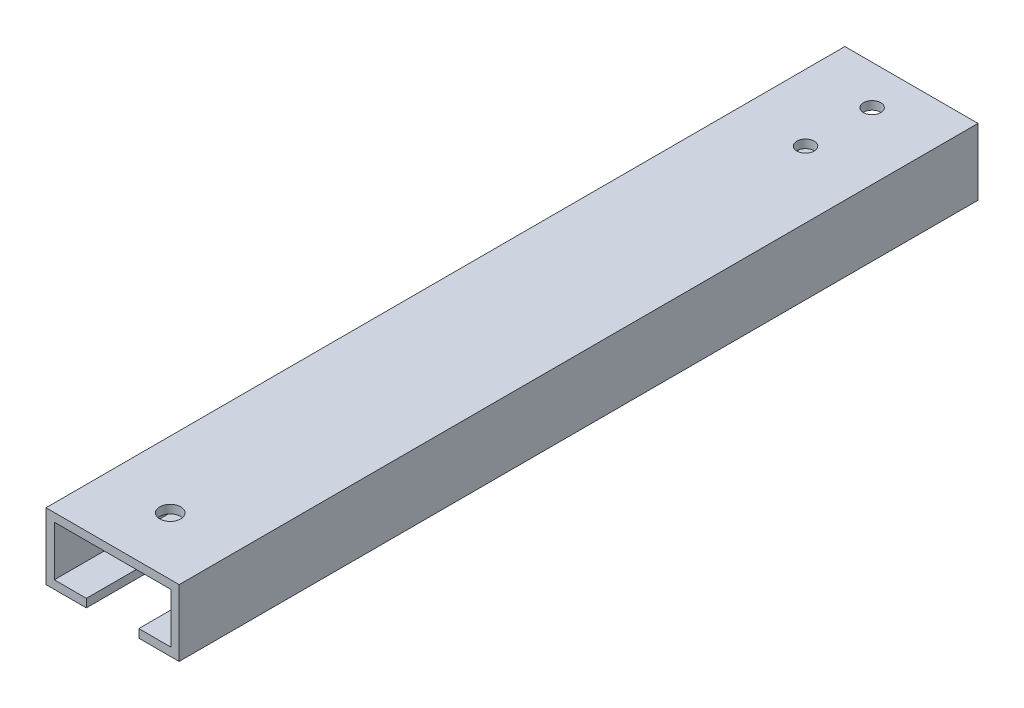
ISO-10303-21;
HEADER;
FILE_DESCRIPTION(('STEP AP214'),'2;1');
FILE_NAME('part.step','',(''),(''),'','','');
FILE_SCHEMA(('AUTOMOTIVE_DESIGN { 1 0 10303 214 1 1 1 1 }'));
ENDSEC;
DATA;
#1=APPLICATION_CONTEXT('core data for automotive mechanical design processes');
#2=APPLICATION_PROTOCOL_DEFINITION('international standard','automotive_design',2000,#1);
#3=PRODUCT_CONTEXT('',#1,'mechanical');
#4=PRODUCT('Part','Part','',(#3));
#5=PRODUCT_RELATED_PRODUCT_CATEGORY('part','',(#4));
#6=PRODUCT_DEFINITION_FORMATION('','',#4);
#7=PRODUCT_DEFINITION_CONTEXT('part definition',#1,'design');
#8=PRODUCT_DEFINITION('design','',#6,#7);
#9=PRODUCT_DEFINITION_SHAPE('','',#8);
#10=(LENGTH_UNIT() NAMED_UNIT(*) SI_UNIT(.MILLI.,.METRE.));
#11=(NAMED_UNIT(*) PLANE_ANGLE_UNIT() SI_UNIT($,.RADIAN.));
#12=(NAMED_UNIT(*) SI_UNIT($,.STERADIAN.) SOLID_ANGLE_UNIT());
#13=UNCERTAINTY_MEASURE_WITH_UNIT(LENGTH_MEASURE(1.E-05),#10,'distance_accuracy_value','');
#14=(GEOMETRIC_REPRESENTATION_CONTEXT(3) GLOBAL_UNCERTAINTY_ASSIGNED_CONTEXT((#13)) GLOBAL_UNIT_ASSIGNED_CONTEXT((#10,
#11,#12)) REPRESENTATION_CONTEXT('',''));
#15=CARTESIAN_POINT('',(0.,0.,0.));
#16=DIRECTION('',(0.,0.,1.));
#17=DIRECTION('',(1.,0.,0.));
#18=AXIS2_PLACEMENT_3D('',#15,#16,#17);
#19=CARTESIAN_POINT('',(-11.1125,-4.7625,152.4));
#20=DIRECTION('',(0.,1.,0.));
#21=DIRECTION('',(-1.,0.,0.));
#22=AXIS2_PLACEMENT_3D('',#19,#20,#21);
#23=PLANE('',#22);
#24=CARTESIAN_POINT('',(0.,-4.7625,20.199999986));
#25=DIRECTION('',(0.,1.,0.));
#26=DIRECTION('',(-1.,0.,0.));
#27=AXIS2_PLACEMENT_3D('',#24,#25,#26);
#28=CIRCLE('',#27,1.64999999999999);
#29=CARTESIAN_POINT('',(-1.64999999999999,-4.7625,20.199999986));
#30=VERTEX_POINT('',#29);
#31=EDGE_CURVE('E370',#30,#30,#28,.T.);
#32=ORIENTED_EDGE('',*,*,#31,.F.);
#33=EDGE_LOOP('',(#32));
#34=FACE_BOUND('',#33,.T.);
#35=CARTESIAN_POINT('',(0.,-4.7625,7.5));
#36=DIRECTION('',(0.,1.,0.));
#37=DIRECTION('',(-1.,0.,0.));
#38=AXIS2_PLACEMENT_3D('',#35,#36,#37);
#39=CIRCLE('',#38,1.64999999999999);
#40=CARTESIAN_POINT('',(-1.64999999999999,-4.7625,7.5));
#41=VERTEX_POINT('',#40);
#42=EDGE_CURVE('E158',#41,#41,#39,.T.);
#43=ORIENTED_EDGE('',*,*,#42,.F.);
#44=EDGE_LOOP('',(#43));
#45=FACE_BOUND('',#44,.T.);
#46=CARTESIAN_POINT('',(7.99999999999989,-4.7625,141.400000000002));
#47=DIRECTION('',(0.,1.,0.));
#48=DIRECTION('',(-1.,0.,0.));
#49=AXIS2_PLACEMENT_3D('',#46,#47,#48);
#50=CIRCLE('',#49,1.50041933445592);
#51=CARTESIAN_POINT('',(6.49958066554398,-4.7625,141.400000000002));
#52=VERTEX_POINT('',#51);
#53=EDGE_CURVE('E149',#52,#52,#50,.F.);
#54=ORIENTED_EDGE('',*,*,#53,.T.);
#55=EDGE_LOOP('',(#54));
#56=FACE_BOUND('',#55,.T.);
#57=CARTESIAN_POINT('',(-8.00000000000234,-4.7625,141.4));
#58=DIRECTION('',(0.,1.,0.));
#59=DIRECTION('',(-1.,0.,0.));
#60=AXIS2_PLACEMENT_3D('',#57,#58,#59);
#61=CIRCLE('',#60,1.50041933445598);
#62=CARTESIAN_POINT('',(-9.50041933445832,-4.7625,141.4));
#63=VERTEX_POINT('',#62);
#64=EDGE_CURVE('E180',#63,#63,#61,.F.);
#65=ORIENTED_EDGE('',*,*,#64,.T.);
#66=EDGE_LOOP('',(#65));
#67=FACE_BOUND('',#66,.T.);
#68=DIRECTION('',(1.,0.,0.));
#69=VECTOR('',#68,1.);
#70=CARTESIAN_POINT('',(-11.1125,-4.7625,136.400000000001));
#71=LINE('',#70,#69);
#72=CARTESIAN_POINT('',(-5.00000000000122,-4.7625,136.400000000001));
#73=VERTEX_POINT('',#72);
#74=CARTESIAN_POINT('',(4.99999999999878,-4.76250000000006,136.400000000001));
#75=VERTEX_POINT('',#74);
#76=EDGE_CURVE('E52',#73,#75,#71,.T.);
#77=ORIENTED_EDGE('',*,*,#76,.T.);
#78=DIRECTION('',(0.,0.,1.));
#79=VECTOR('',#78,1.);
#80=CARTESIAN_POINT('',(4.99999999999878,-4.7625,152.4));
#81=LINE('',#80,#79);
#82=CARTESIAN_POINT('',(4.99999999999878,-4.76250000000006,152.4));
#83=VERTEX_POINT('',#82);
#84=EDGE_CURVE('E11',#75,#83,#81,.T.);
#85=ORIENTED_EDGE('',*,*,#84,.T.);
#86=DIRECTION('',(1.,0.,0.));
#87=VECTOR('',#86,1.);
#88=CARTESIAN_POINT('',(-11.1125,-4.7625,152.4));
#89=LINE('',#88,#87);
#90=CARTESIAN_POINT('',(11.1125,-4.7625,152.4));
#91=VERTEX_POINT('',#90);
#92=EDGE_CURVE('E203',#83,#91,#89,.T.);
#93=ORIENTED_EDGE('',*,*,#92,.T.);
#94=DIRECTION('',(0.,0.,-1.));
#95=VECTOR('',#94,1.);
#96=CARTESIAN_POINT('',(11.1125,-4.7625,152.4));
#97=LINE('',#96,#95);
#98=CARTESIAN_POINT('',(11.1125,-4.7625,0.));
#99=VERTEX_POINT('',#98);
#100=EDGE_CURVE('E235',#91,#99,#97,.T.);
#101=ORIENTED_EDGE('',*,*,#100,.T.);
#102=DIRECTION('',(1.,0.,0.));
#103=VECTOR('',#102,1.);
#104=CARTESIAN_POINT('',(-11.1125,-4.7625,0.));
#105=LINE('',#104,#103);
#106=CARTESIAN_POINT('',(-11.1125,-4.7625,0.));
#107=VERTEX_POINT('',#106);
#108=EDGE_CURVE('E219',#107,#99,#105,.T.);
#109=ORIENTED_EDGE('',*,*,#108,.F.);
#110=DIRECTION('',(0.,0.,-1.));
#111=VECTOR('',#110,1.);
#112=CARTESIAN_POINT('',(-11.1125,-4.7625,152.4));
#113=LINE('',#112,#111);
#114=CARTESIAN_POINT('',(-11.1125,-4.7625,152.4));
#115=VERTEX_POINT('',#114);
#116=EDGE_CURVE('E238',#115,#107,#113,.T.);
#117=ORIENTED_EDGE('',*,*,#116,.F.);
#118=CARTESIAN_POINT('',(-5.00000000000122,-4.76250000000006,152.4));
#119=VERTEX_POINT('',#118);
#120=EDGE_CURVE('E205',#115,#119,#89,.T.);
#121=ORIENTED_EDGE('',*,*,#120,.T.);
#122=DIRECTION('',(0.,0.,-1.));
#123=VECTOR('',#122,1.);
#124=CARTESIAN_POINT('',(-5.00000000000122,-4.7625,152.4));
#125=LINE('',#124,#123);
#126=EDGE_CURVE('E285',#119,#73,#125,.T.);
#127=ORIENTED_EDGE('',*,*,#126,.T.);
#128=EDGE_LOOP('',(#77,#85,#93,#101,#109,#117,#121,#127));
#129=FACE_BOUND('',#128,.T.);
#130=ADVANCED_FACE('F43',(#34,#45,#56,#67,#129),#23,.T.);
#131=CARTESIAN_POINT('',(0.,0.,152.4));
#132=DIRECTION('',(0.,0.,1.));
#133=DIRECTION('',(1.,0.,0.));
#134=AXIS2_PLACEMENT_3D('',#131,#132,#133);
#135=PLANE('',#134);
#136=DIRECTION('',(0.,1.,0.));
#137=VECTOR('',#136,1.);
#138=CARTESIAN_POINT('',(4.99999999999879,-200.129070399773,152.4));
#139=LINE('',#138,#137);
#140=CARTESIAN_POINT('',(4.99999999999878,-6.35000000000005,152.4));
#141=VERTEX_POINT('',#140);
#142=EDGE_CURVE('E150',#141,#83,#139,.T.);
#143=ORIENTED_EDGE('',*,*,#142,.F.);
#144=DIRECTION('',(1.,0.,0.));
#145=VECTOR('',#144,1.);
#146=CARTESIAN_POINT('',(-12.7,-6.35,152.4));
#147=LINE('',#146,#145);
#148=CARTESIAN_POINT('',(12.7,-6.35,152.4));
#149=VERTEX_POINT('',#148);
#150=EDGE_CURVE('E156',#141,#149,#147,.T.);
#151=ORIENTED_EDGE('',*,*,#150,.T.);
#152=DIRECTION('',(0.,1.,0.));
#153=VECTOR('',#152,1.);
#154=CARTESIAN_POINT('',(12.7,-6.35,152.4));
#155=LINE('',#154,#153);
#156=CARTESIAN_POINT('',(12.7,6.35,152.4));
#157=VERTEX_POINT('',#156);
#158=EDGE_CURVE('E252',#149,#157,#155,.T.);
#159=ORIENTED_EDGE('',*,*,#158,.T.);
#160=DIRECTION('',(-1.,0.,0.));
#161=VECTOR('',#160,1.);
#162=CARTESIAN_POINT('',(12.7,6.35,152.4));
#163=LINE('',#162,#161);
#164=CARTESIAN_POINT('',(-12.7,6.35,152.4));
#165=VERTEX_POINT('',#164);
#166=EDGE_CURVE('E255',#157,#165,#163,.T.);
#167=ORIENTED_EDGE('',*,*,#166,.T.);
#168=DIRECTION('',(0.,-1.,0.));
#169=VECTOR('',#168,1.);
#170=CARTESIAN_POINT('',(-12.7,6.35,152.4));
#171=LINE('',#170,#169);
#172=CARTESIAN_POINT('',(-12.7,-6.35,152.4));
#173=VERTEX_POINT('',#172);
#174=EDGE_CURVE('E243',#165,#173,#171,.T.);
#175=ORIENTED_EDGE('',*,*,#174,.T.);
#176=CARTESIAN_POINT('',(-5.00000000000122,-6.35000000000005,152.4));
#177=VERTEX_POINT('',#176);
#178=EDGE_CURVE('E248',#173,#177,#147,.T.);
#179=ORIENTED_EDGE('',*,*,#178,.T.);
#180=DIRECTION('',(0.,1.,0.));
#181=VECTOR('',#180,1.);
#182=CARTESIAN_POINT('',(-5.00000000000121,-200.129070399773,152.4));
#183=LINE('',#182,#181);
#184=EDGE_CURVE('E168',#177,#119,#183,.T.);
#185=ORIENTED_EDGE('',*,*,#184,.T.);
#186=ORIENTED_EDGE('',*,*,#120,.F.);
#187=DIRECTION('',(0.,-1.,0.));
#188=VECTOR('',#187,1.);
#189=CARTESIAN_POINT('',(-11.1125,4.7625,152.4));
#190=LINE('',#189,#188);
#191=CARTESIAN_POINT('',(-11.1125,4.7625,152.4));
#192=VERTEX_POINT('',#191);
#193=EDGE_CURVE('E200',#192,#115,#190,.T.);
#194=ORIENTED_EDGE('',*,*,#193,.F.);
#195=DIRECTION('',(-1.,0.,0.));
#196=VECTOR('',#195,1.);
#197=CARTESIAN_POINT('',(11.1125,4.7625,152.4));
#198=LINE('',#197,#196);
#199=CARTESIAN_POINT('',(11.1125,4.7625,152.4));
#200=VERTEX_POINT('',#199);
#201=EDGE_CURVE('E212',#200,#192,#198,.T.);
#202=ORIENTED_EDGE('',*,*,#201,.F.);
#203=DIRECTION('',(0.,1.,0.));
#204=VECTOR('',#203,1.);
#205=CARTESIAN_POINT('',(11.1125,-4.7625,152.4));
#206=LINE('',#205,#204);
#207=EDGE_CURVE('E209',#91,#200,#206,.T.);
#208=ORIENTED_EDGE('',*,*,#207,.F.);
#209=ORIENTED_EDGE('',*,*,#92,.F.);
#210=EDGE_LOOP('',(#143,#151,#159,#167,#175,#179,#185,#186,#194,#202,#208,#209));
#211=FACE_BOUND('',#210,.T.);
#212=ADVANCED_FACE('F295',(#211),#135,.T.);
#213=CARTESIAN_POINT('',(0.,0.,0.));
#214=DIRECTION('',(0.,0.,1.));
#215=DIRECTION('',(1.,0.,0.));
#216=AXIS2_PLACEMENT_3D('',#213,#214,#215);
#217=PLANE('',#216);
#218=DIRECTION('',(0.,-1.,0.));
#219=VECTOR('',#218,1.);
#220=CARTESIAN_POINT('',(-12.7,6.35,0.));
#221=LINE('',#220,#219);
#222=CARTESIAN_POINT('',(-12.7,6.35,0.));
#223=VERTEX_POINT('',#222);
#224=CARTESIAN_POINT('',(-12.7,-6.35,0.));
#225=VERTEX_POINT('',#224);
#226=EDGE_CURVE('E242',#223,#225,#221,.T.);
#227=ORIENTED_EDGE('',*,*,#226,.F.);
#228=DIRECTION('',(-1.,0.,0.));
#229=VECTOR('',#228,1.);
#230=CARTESIAN_POINT('',(12.7,6.35,0.));
#231=LINE('',#230,#229);
#232=CARTESIAN_POINT('',(12.7,6.35,0.));
#233=VERTEX_POINT('',#232);
#234=EDGE_CURVE('E247',#233,#223,#231,.T.);
#235=ORIENTED_EDGE('',*,*,#234,.F.);
#236=DIRECTION('',(0.,1.,0.));
#237=VECTOR('',#236,1.);
#238=CARTESIAN_POINT('',(12.7,-6.35,0.));
#239=LINE('',#238,#237);
#240=CARTESIAN_POINT('',(12.7,-6.35,0.));
#241=VERTEX_POINT('',#240);
#242=EDGE_CURVE('E265',#241,#233,#239,.T.);
#243=ORIENTED_EDGE('',*,*,#242,.F.);
#244=DIRECTION('',(1.,0.,0.));
#245=VECTOR('',#244,1.);
#246=CARTESIAN_POINT('',(-12.7,-6.35,0.));
#247=LINE('',#246,#245);
#248=EDGE_CURVE('E262',#225,#241,#247,.T.);
#249=ORIENTED_EDGE('',*,*,#248,.F.);
#250=EDGE_LOOP('',(#227,#235,#243,#249));
#251=FACE_BOUND('',#250,.T.);
#252=DIRECTION('',(0.,-1.,0.));
#253=VECTOR('',#252,1.);
#254=CARTESIAN_POINT('',(-11.1125,4.7625,0.));
#255=LINE('',#254,#253);
#256=CARTESIAN_POINT('',(-11.1125,4.7625,0.));
#257=VERTEX_POINT('',#256);
#258=EDGE_CURVE('E199',#257,#107,#255,.T.);
#259=ORIENTED_EDGE('',*,*,#258,.T.);
#260=ORIENTED_EDGE('',*,*,#108,.T.);
#261=DIRECTION('',(0.,1.,0.));
#262=VECTOR('',#261,1.);
#263=CARTESIAN_POINT('',(11.1125,-4.7625,0.));
#264=LINE('',#263,#262);
#265=CARTESIAN_POINT('',(11.1125,4.7625,0.));
#266=VERTEX_POINT('',#265);
#267=EDGE_CURVE('E223',#99,#266,#264,.T.);
#268=ORIENTED_EDGE('',*,*,#267,.T.);
#269=DIRECTION('',(-1.,0.,0.));
#270=VECTOR('',#269,1.);
#271=CARTESIAN_POINT('',(11.1125,4.7625,0.));
#272=LINE('',#271,#270);
#273=EDGE_CURVE('E204',#266,#257,#272,.T.);
#274=ORIENTED_EDGE('',*,*,#273,.T.);
#275=EDGE_LOOP('',(#259,#260,#268,#274));
#276=FACE_BOUND('',#275,.T.);
#277=ADVANCED_FACE('F304',(#251,#276),#217,.F.);
#278=CARTESIAN_POINT('',(-12.7,6.35,152.4));
#279=DIRECTION('',(1.,0.,0.));
#280=DIRECTION('',(0.,0.,-1.));
#281=AXIS2_PLACEMENT_3D('',#278,#279,#280);
#282=PLANE('',#281);
#283=ORIENTED_EDGE('',*,*,#226,.T.);
#284=DIRECTION('',(0.,0.,-1.));
#285=VECTOR('',#284,1.);
#286=CARTESIAN_POINT('',(-12.7,-6.35,152.4));
#287=LINE('',#286,#285);
#288=EDGE_CURVE('E281',#173,#225,#287,.T.);
#289=ORIENTED_EDGE('',*,*,#288,.F.);
#290=ORIENTED_EDGE('',*,*,#174,.F.);
#291=DIRECTION('',(0.,0.,-1.));
#292=VECTOR('',#291,1.);
#293=CARTESIAN_POINT('',(-12.7,6.35,152.4));
#294=LINE('',#293,#292);
#295=EDGE_CURVE('E258',#165,#223,#294,.T.);
#296=ORIENTED_EDGE('',*,*,#295,.T.);
#297=EDGE_LOOP('',(#283,#289,#290,#296));
#298=FACE_BOUND('',#297,.T.);
#299=ADVANCED_FACE('F45',(#298),#282,.F.);
#300=CARTESIAN_POINT('',(-12.7,-6.35,152.4));
#301=DIRECTION('',(0.,1.,0.));
#302=DIRECTION('',(-1.,0.,0.));
#303=AXIS2_PLACEMENT_3D('',#300,#301,#302);
#304=PLANE('',#303);
#305=CARTESIAN_POINT('',(0.,-6.35,20.199999986));
#306=DIRECTION('',(0.,-1.,0.));
#307=DIRECTION('',(0.,0.,-1.));
#308=AXIS2_PLACEMENT_3D('',#305,#306,#307);
#309=CIRCLE('',#308,1.64999999999999);
#310=CARTESIAN_POINT('',(0.,-6.35,18.549999986));
#311=VERTEX_POINT('',#310);
#312=EDGE_CURVE('E363',#311,#311,#309,.T.);
#313=ORIENTED_EDGE('',*,*,#312,.F.);
#314=EDGE_LOOP('',(#313));
#315=FACE_BOUND('',#314,.T.);
#316=CARTESIAN_POINT('',(0.,-6.35,7.5));
#317=DIRECTION('',(0.,-1.,0.));
#318=DIRECTION('',(0.,0.,-1.));
#319=AXIS2_PLACEMENT_3D('',#316,#317,#318);
#320=CIRCLE('',#319,1.64999999999999);
#321=CARTESIAN_POINT('',(0.,-6.35,5.85000000000001));
#322=VERTEX_POINT('',#321);
#323=EDGE_CURVE('E366',#322,#322,#320,.T.);
#324=ORIENTED_EDGE('',*,*,#323,.F.);
#325=EDGE_LOOP('',(#324));
#326=FACE_BOUND('',#325,.T.);
#327=ORIENTED_EDGE('',*,*,#150,.F.);
#328=DIRECTION('',(0.,0.,-1.));
#329=VECTOR('',#328,1.);
#330=CARTESIAN_POINT('',(4.99999999999878,-6.34999999999999,136.400000000001));
#331=LINE('',#330,#329);
#332=CARTESIAN_POINT('',(4.99999999999878,-6.35000000000005,136.400000000001));
#333=VERTEX_POINT('',#332);
#334=EDGE_CURVE('E143',#141,#333,#331,.T.);
#335=ORIENTED_EDGE('',*,*,#334,.T.);
#336=DIRECTION('',(-1.,0.,0.));
#337=VECTOR('',#336,1.);
#338=CARTESIAN_POINT('',(-5.00000000000122,-6.34999999999999,136.400000000001));
#339=LINE('',#338,#337);
#340=CARTESIAN_POINT('',(-5.00000000000122,-6.35000000000005,136.400000000001));
#341=VERTEX_POINT('',#340);
#342=EDGE_CURVE('E133',#333,#341,#339,.T.);
#343=ORIENTED_EDGE('',*,*,#342,.T.);
#344=DIRECTION('',(0.,0.,1.));
#345=VECTOR('',#344,1.);
#346=CARTESIAN_POINT('',(-5.00000000000122,-6.34999999999999,152.4));
#347=LINE('',#346,#345);
#348=EDGE_CURVE('E142',#341,#177,#347,.T.);
#349=ORIENTED_EDGE('',*,*,#348,.T.);
#350=ORIENTED_EDGE('',*,*,#178,.F.);
#351=ORIENTED_EDGE('',*,*,#288,.T.);
#352=ORIENTED_EDGE('',*,*,#248,.T.);
#353=DIRECTION('',(0.,0.,-1.));
#354=VECTOR('',#353,1.);
#355=CARTESIAN_POINT('',(12.7,-6.35,152.4));
#356=LINE('',#355,#354);
#357=EDGE_CURVE('E277',#149,#241,#356,.T.);
#358=ORIENTED_EDGE('',*,*,#357,.F.);
#359=EDGE_LOOP('',(#327,#335,#343,#349,#350,#351,#352,#358));
#360=FACE_BOUND('',#359,.T.);
#361=CARTESIAN_POINT('',(-8.00000000000234,-6.35,141.4));
#362=DIRECTION('',(0.,-1.,0.));
#363=DIRECTION('',(1.,0.,0.));
#364=AXIS2_PLACEMENT_3D('',#361,#362,#363);
#365=CIRCLE('',#364,1.50041933445598);
#366=CARTESIAN_POINT('',(-6.49958066554636,-6.35,141.4));
#367=VERTEX_POINT('',#366);
#368=EDGE_CURVE('E176',#367,#367,#365,.T.);
#369=ORIENTED_EDGE('',*,*,#368,.F.);
#370=EDGE_LOOP('',(#369));
#371=FACE_BOUND('',#370,.T.);
#372=CARTESIAN_POINT('',(7.99999999999989,-6.35,141.400000000002));
#373=DIRECTION('',(0.,-1.,0.));
#374=DIRECTION('',(1.,0.,0.));
#375=AXIS2_PLACEMENT_3D('',#372,#373,#374);
#376=CIRCLE('',#375,1.50041933445592);
#377=CARTESIAN_POINT('',(9.50041933445581,-6.35,141.400000000002));
#378=VERTEX_POINT('',#377);
#379=EDGE_CURVE('E181',#378,#378,#376,.T.);
#380=ORIENTED_EDGE('',*,*,#379,.F.);
#381=EDGE_LOOP('',(#380));
#382=FACE_BOUND('',#381,.T.);
#383=ADVANCED_FACE('F153',(#315,#326,#360,#371,#382),#304,.F.);
#384=CARTESIAN_POINT('',(12.7,-6.35,152.4));
#385=DIRECTION('',(-1.,0.,0.));
#386=DIRECTION('',(0.,0.,1.));
#387=AXIS2_PLACEMENT_3D('',#384,#385,#386);
#388=PLANE('',#387);
#389=ORIENTED_EDGE('',*,*,#242,.T.);
#390=DIRECTION('',(0.,0.,-1.));
#391=VECTOR('',#390,1.);
#392=CARTESIAN_POINT('',(12.7,6.35,152.4));
#393=LINE('',#392,#391);
#394=EDGE_CURVE('E273',#157,#233,#393,.T.);
#395=ORIENTED_EDGE('',*,*,#394,.F.);
#396=ORIENTED_EDGE('',*,*,#158,.F.);
#397=ORIENTED_EDGE('',*,*,#357,.T.);
#398=EDGE_LOOP('',(#389,#395,#396,#397));
#399=FACE_BOUND('',#398,.T.);
#400=ADVANCED_FACE('F309',(#399),#388,.F.);
#401=CARTESIAN_POINT('',(12.7,6.35,152.4));
#402=DIRECTION('',(0.,-1.,0.));
#403=DIRECTION('',(0.,0.,-1.));
#404=AXIS2_PLACEMENT_3D('',#401,#402,#403);
#405=PLANE('',#404);
#406=CARTESIAN_POINT('',(0.,6.35,20.199999986));
#407=DIRECTION('',(0.,-1.,0.));
#408=DIRECTION('',(0.,0.,-1.));
#409=AXIS2_PLACEMENT_3D('',#406,#407,#408);
#410=CIRCLE('',#409,1.65);
#411=CARTESIAN_POINT('',(0.,6.35,18.549999986));
#412=VERTEX_POINT('',#411);
#413=EDGE_CURVE('E428',#412,#412,#410,.T.);
#414=ORIENTED_EDGE('',*,*,#413,.T.);
#415=EDGE_LOOP('',(#414));
#416=FACE_BOUND('',#415,.T.);
#417=CARTESIAN_POINT('',(0.,6.35,7.5));
#418=DIRECTION('',(0.,-1.,0.));
#419=DIRECTION('',(0.,0.,-1.));
#420=AXIS2_PLACEMENT_3D('',#417,#418,#419);
#421=CIRCLE('',#420,1.65);
#422=CARTESIAN_POINT('',(0.,6.35,5.85));
#423=VERTEX_POINT('',#422);
#424=EDGE_CURVE('E369',#423,#423,#421,.T.);
#425=ORIENTED_EDGE('',*,*,#424,.T.);
#426=EDGE_LOOP('',(#425));
#427=FACE_BOUND('',#426,.T.);
#428=CARTESIAN_POINT('',(-2.24820162486594E-12,6.35,141.4));
#429=DIRECTION('',(0.,1.,0.));
#430=DIRECTION('',(0.,0.,1.));
#431=AXIS2_PLACEMENT_3D('',#428,#429,#430);
#432=CIRCLE('',#431,2.);
#433=CARTESIAN_POINT('',(-2.24820162486594E-12,6.35,143.4));
#434=VERTEX_POINT('',#433);
#435=EDGE_CURVE('E185',#434,#434,#432,.T.);
#436=ORIENTED_EDGE('',*,*,#435,.F.);
#437=EDGE_LOOP('',(#436));
#438=FACE_BOUND('',#437,.T.);
#439=ORIENTED_EDGE('',*,*,#234,.T.);
#440=ORIENTED_EDGE('',*,*,#295,.F.);
#441=ORIENTED_EDGE('',*,*,#166,.F.);
#442=ORIENTED_EDGE('',*,*,#394,.T.);
#443=EDGE_LOOP('',(#439,#440,#441,#442));
#444=FACE_BOUND('',#443,.T.);
#445=ADVANCED_FACE('F313',(#416,#427,#438,#444),#405,.F.);
#446=CARTESIAN_POINT('',(-11.1125,4.7625,152.4));
#447=DIRECTION('',(1.,0.,0.));
#448=DIRECTION('',(0.,1.,0.));
#449=AXIS2_PLACEMENT_3D('',#446,#447,#448);
#450=PLANE('',#449);
#451=ORIENTED_EDGE('',*,*,#258,.F.);
#452=DIRECTION('',(0.,0.,-1.));
#453=VECTOR('',#452,1.);
#454=CARTESIAN_POINT('',(-11.1125,4.7625,152.4));
#455=LINE('',#454,#453);
#456=EDGE_CURVE('E215',#192,#257,#455,.T.);
#457=ORIENTED_EDGE('',*,*,#456,.F.);
#458=ORIENTED_EDGE('',*,*,#193,.T.);
#459=ORIENTED_EDGE('',*,*,#116,.T.);
#460=EDGE_LOOP('',(#451,#457,#458,#459));
#461=FACE_BOUND('',#460,.T.);
#462=ADVANCED_FACE('F325',(#461),#450,.T.);
#463=CARTESIAN_POINT('',(11.1125,-4.7625,152.4));
#464=DIRECTION('',(-1.,0.,0.));
#465=DIRECTION('',(0.,-1.,0.));
#466=AXIS2_PLACEMENT_3D('',#463,#464,#465);
#467=PLANE('',#466);
#468=ORIENTED_EDGE('',*,*,#267,.F.);
#469=ORIENTED_EDGE('',*,*,#100,.F.);
#470=ORIENTED_EDGE('',*,*,#207,.T.);
#471=DIRECTION('',(0.,0.,-1.));
#472=VECTOR('',#471,1.);
#473=CARTESIAN_POINT('',(11.1125,4.7625,152.4));
#474=LINE('',#473,#472);
#475=EDGE_CURVE('E67',#200,#266,#474,.T.);
#476=ORIENTED_EDGE('',*,*,#475,.T.);
#477=EDGE_LOOP('',(#468,#469,#470,#476));
#478=FACE_BOUND('',#477,.T.);
#479=ADVANCED_FACE('F320',(#478),#467,.T.);
#480=CARTESIAN_POINT('',(11.1125,4.7625,152.4));
#481=DIRECTION('',(0.,-1.,0.));
#482=DIRECTION('',(0.,0.,-1.));
#483=AXIS2_PLACEMENT_3D('',#480,#481,#482);
#484=PLANE('',#483);
#485=CARTESIAN_POINT('',(0.,4.7625,20.199999986));
#486=DIRECTION('',(0.,-1.,0.));
#487=DIRECTION('',(0.,0.,-1.));
#488=AXIS2_PLACEMENT_3D('',#485,#486,#487);
#489=CIRCLE('',#488,1.64999999999999);
#490=CARTESIAN_POINT('',(0.,4.7625,18.549999986));
#491=VERTEX_POINT('',#490);
#492=EDGE_CURVE('E377',#491,#491,#489,.T.);
#493=ORIENTED_EDGE('',*,*,#492,.F.);
#494=EDGE_LOOP('',(#493));
#495=FACE_BOUND('',#494,.T.);
#496=CARTESIAN_POINT('',(0.,4.7625,7.5));
#497=DIRECTION('',(0.,-1.,0.));
#498=DIRECTION('',(0.,0.,-1.));
#499=AXIS2_PLACEMENT_3D('',#496,#497,#498);
#500=CIRCLE('',#499,1.64999999999999);
#501=CARTESIAN_POINT('',(0.,4.7625,5.85000000000001));
#502=VERTEX_POINT('',#501);
#503=EDGE_CURVE('E162',#502,#502,#500,.T.);
#504=ORIENTED_EDGE('',*,*,#503,.F.);
#505=EDGE_LOOP('',(#504));
#506=FACE_BOUND('',#505,.T.);
#507=CARTESIAN_POINT('',(-2.24820162486594E-12,4.7625,141.4));
#508=DIRECTION('',(0.,-1.,0.));
#509=DIRECTION('',(0.,0.,-1.));
#510=AXIS2_PLACEMENT_3D('',#507,#508,#509);
#511=CIRCLE('',#510,2.);
#512=CARTESIAN_POINT('',(-2.24820162486594E-12,4.7625,139.4));
#513=VERTEX_POINT('',#512);
#514=EDGE_CURVE('E195',#513,#513,#511,.F.);
#515=ORIENTED_EDGE('',*,*,#514,.T.);
#516=EDGE_LOOP('',(#515));
#517=FACE_BOUND('',#516,.T.);
#518=ORIENTED_EDGE('',*,*,#273,.F.);
#519=ORIENTED_EDGE('',*,*,#475,.F.);
#520=ORIENTED_EDGE('',*,*,#201,.T.);
#521=ORIENTED_EDGE('',*,*,#456,.T.);
#522=EDGE_LOOP('',(#518,#519,#520,#521));
#523=FACE_BOUND('',#522,.T.);
#524=ADVANCED_FACE('F323',(#495,#506,#517,#523),#484,.T.);
#525=CARTESIAN_POINT('',(-2.24820162486594E-12,-0.894354249492386,141.4));
#526=DIRECTION('',(0.,1.,0.));
#527=DIRECTION('',(0.,0.,1.));
#528=AXIS2_PLACEMENT_3D('',#525,#526,#527);
#529=CYLINDRICAL_SURFACE('',#528,2.);
#530=ORIENTED_EDGE('',*,*,#435,.T.);
#531=EDGE_LOOP('',(#530));
#532=FACE_BOUND('',#531,.T.);
#533=ORIENTED_EDGE('',*,*,#514,.F.);
#534=EDGE_LOOP('',(#533));
#535=FACE_BOUND('',#534,.T.);
#536=ADVANCED_FACE('F389',(#532,#535),#529,.F.);
#537=CARTESIAN_POINT('',(7.99999999999989,-0.518673255931035,141.400000000002));
#538=DIRECTION('',(0.,-1.,0.));
#539=DIRECTION('',(1.,0.,0.));
#540=AXIS2_PLACEMENT_3D('',#537,#538,#539);
#541=CYLINDRICAL_SURFACE('',#540,1.50041933445592);
#542=ORIENTED_EDGE('',*,*,#379,.T.);
#543=EDGE_LOOP('',(#542));
#544=FACE_BOUND('',#543,.T.);
#545=ORIENTED_EDGE('',*,*,#53,.F.);
#546=EDGE_LOOP('',(#545));
#547=FACE_BOUND('',#546,.T.);
#548=ADVANCED_FACE('F394',(#544,#547),#541,.F.);
#549=CARTESIAN_POINT('',(-8.00000000000234,-0.518673255931037,141.4));
#550=DIRECTION('',(0.,-1.,0.));
#551=DIRECTION('',(1.,0.,0.));
#552=AXIS2_PLACEMENT_3D('',#549,#550,#551);
#553=CYLINDRICAL_SURFACE('',#552,1.50041933445598);
#554=ORIENTED_EDGE('',*,*,#368,.T.);
#555=EDGE_LOOP('',(#554));
#556=FACE_BOUND('',#555,.T.);
#557=ORIENTED_EDGE('',*,*,#64,.F.);
#558=EDGE_LOOP('',(#557));
#559=FACE_BOUND('',#558,.T.);
#560=ADVANCED_FACE('F400',(#556,#559),#553,.F.);
#561=CARTESIAN_POINT('',(4.99999999999879,-200.129070399773,136.400000000001));
#562=DIRECTION('',(-1.,0.,0.));
#563=DIRECTION('',(0.,-1.,0.));
#564=AXIS2_PLACEMENT_3D('',#561,#562,#563);
#565=PLANE('',#564);
#566=ORIENTED_EDGE('',*,*,#84,.F.);
#567=DIRECTION('',(0.,1.,0.));
#568=VECTOR('',#567,1.);
#569=CARTESIAN_POINT('',(4.99999999999879,-200.129070399773,136.400000000001));
#570=LINE('',#569,#568);
#571=EDGE_CURVE('E136',#333,#75,#570,.T.);
#572=ORIENTED_EDGE('',*,*,#571,.F.);
#573=ORIENTED_EDGE('',*,*,#334,.F.);
#574=ORIENTED_EDGE('',*,*,#142,.T.);
#575=EDGE_LOOP('',(#566,#572,#573,#574));
#576=FACE_BOUND('',#575,.T.);
#577=ADVANCED_FACE('F146',(#576),#565,.T.);
#578=CARTESIAN_POINT('',(-5.00000000000121,-200.129070399773,136.400000000001));
#579=DIRECTION('',(0.,0.,1.));
#580=DIRECTION('',(1.,0.,0.));
#581=AXIS2_PLACEMENT_3D('',#578,#579,#580);
#582=PLANE('',#581);
#583=ORIENTED_EDGE('',*,*,#76,.F.);
#584=DIRECTION('',(0.,1.,0.));
#585=VECTOR('',#584,1.);
#586=CARTESIAN_POINT('',(-5.00000000000121,-200.129070399773,136.400000000001));
#587=LINE('',#586,#585);
#588=EDGE_CURVE('E59',#341,#73,#587,.T.);
#589=ORIENTED_EDGE('',*,*,#588,.F.);
#590=ORIENTED_EDGE('',*,*,#342,.F.);
#591=ORIENTED_EDGE('',*,*,#571,.T.);
#592=EDGE_LOOP('',(#583,#589,#590,#591));
#593=FACE_BOUND('',#592,.T.);
#594=ADVANCED_FACE('F135',(#593),#582,.T.);
#595=CARTESIAN_POINT('',(-5.00000000000121,-200.129070399773,152.4));
#596=DIRECTION('',(1.,0.,0.));
#597=DIRECTION('',(0.,0.,-1.));
#598=AXIS2_PLACEMENT_3D('',#595,#596,#597);
#599=PLANE('',#598);
#600=ORIENTED_EDGE('',*,*,#126,.F.);
#601=ORIENTED_EDGE('',*,*,#184,.F.);
#602=ORIENTED_EDGE('',*,*,#348,.F.);
#603=ORIENTED_EDGE('',*,*,#588,.T.);
#604=EDGE_LOOP('',(#600,#601,#602,#603));
#605=FACE_BOUND('',#604,.T.);
#606=ADVANCED_FACE('F293',(#605),#599,.T.);
#607=CARTESIAN_POINT('',(0.,-6.35,7.5));
#608=DIRECTION('',(0.,-1.,0.));
#609=DIRECTION('',(0.,0.,-1.));
#610=AXIS2_PLACEMENT_3D('',#607,#608,#609);
#611=CYLINDRICAL_SURFACE('',#610,1.64999999999999);
#612=ORIENTED_EDGE('',*,*,#42,.T.);
#613=EDGE_LOOP('',(#612));
#614=FACE_BOUND('',#613,.T.);
#615=ORIENTED_EDGE('',*,*,#323,.T.);
#616=EDGE_LOOP('',(#615));
#617=FACE_BOUND('',#616,.T.);
#618=ADVANCED_FACE('F413',(#614,#617),#611,.F.);
#619=ORIENTED_EDGE('',*,*,#503,.T.);
#620=EDGE_LOOP('',(#619));
#621=FACE_BOUND('',#620,.T.);
#622=ORIENTED_EDGE('',*,*,#424,.F.);
#623=EDGE_LOOP('',(#622));
#624=FACE_BOUND('',#623,.T.);
#625=ADVANCED_FACE('F384',(#621,#624),#611,.F.);
#626=CARTESIAN_POINT('',(0.,-6.35,20.199999986));
#627=DIRECTION('',(0.,-1.,0.));
#628=DIRECTION('',(0.,0.,-1.));
#629=AXIS2_PLACEMENT_3D('',#626,#627,#628);
#630=CYLINDRICAL_SURFACE('',#629,1.64999999999999);
#631=ORIENTED_EDGE('',*,*,#492,.T.);
#632=EDGE_LOOP('',(#631));
#633=FACE_BOUND('',#632,.T.);
#634=ORIENTED_EDGE('',*,*,#413,.F.);
#635=EDGE_LOOP('',(#634));
#636=FACE_BOUND('',#635,.T.);
#637=ADVANCED_FACE('F416',(#633,#636),#630,.F.);
#638=ORIENTED_EDGE('',*,*,#31,.T.);
#639=EDGE_LOOP('',(#638));
#640=FACE_BOUND('',#639,.T.);
#641=ORIENTED_EDGE('',*,*,#312,.T.);
#642=EDGE_LOOP('',(#641));
#643=FACE_BOUND('',#642,.T.);
#644=ADVANCED_FACE('F418',(#640,#643),#630,.F.);
#645=CLOSED_SHELL('',(#130,#212,#277,#299,#383,#400,#445,#462,#479,#524,#536,#548,#560,#577,
#594,#606,#618,#625,#637,#644));
#646=MANIFOLD_SOLID_BREP('B2',#645);
#647=ADVANCED_BREP_SHAPE_REPRESENTATION('',(#18,#646),#14);
#648=SHAPE_DEFINITION_REPRESENTATION(#9,#647);
ENDSEC;
END-ISO-10303-21;
